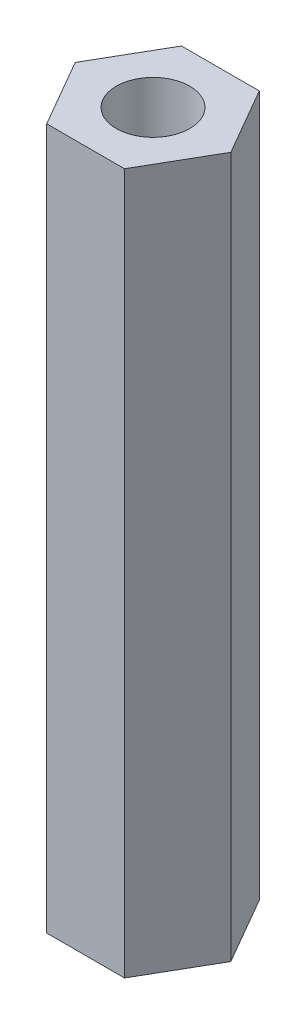
ISO-10303-21;
HEADER;
FILE_DESCRIPTION(('STEP AP214'),'2;1');
FILE_NAME('part.step','',(''),(''),'','','');
FILE_SCHEMA(('AUTOMOTIVE_DESIGN { 1 0 10303 214 1 1 1 1 }'));
ENDSEC;
DATA;
#1=APPLICATION_CONTEXT('core data for automotive mechanical design processes');
#2=APPLICATION_PROTOCOL_DEFINITION('international standard','automotive_design',2000,#1);
#3=PRODUCT_CONTEXT('',#1,'mechanical');
#4=PRODUCT('Part','Part','',(#3));
#5=PRODUCT_RELATED_PRODUCT_CATEGORY('part','',(#4));
#6=PRODUCT_DEFINITION_FORMATION('','',#4);
#7=PRODUCT_DEFINITION_CONTEXT('part definition',#1,'design');
#8=PRODUCT_DEFINITION('design','',#6,#7);
#9=PRODUCT_DEFINITION_SHAPE('','',#8);
#10=(LENGTH_UNIT() NAMED_UNIT(*) SI_UNIT(.MILLI.,.METRE.));
#11=(NAMED_UNIT(*) PLANE_ANGLE_UNIT() SI_UNIT($,.RADIAN.));
#12=(NAMED_UNIT(*) SI_UNIT($,.STERADIAN.) SOLID_ANGLE_UNIT());
#13=UNCERTAINTY_MEASURE_WITH_UNIT(LENGTH_MEASURE(1.E-05),#10,'distance_accuracy_value','');
#14=(GEOMETRIC_REPRESENTATION_CONTEXT(3) GLOBAL_UNCERTAINTY_ASSIGNED_CONTEXT((#13)) GLOBAL_UNIT_ASSIGNED_CONTEXT((#10,
#11,#12)) REPRESENTATION_CONTEXT('',''));
#15=CARTESIAN_POINT('',(0.,0.,0.));
#16=DIRECTION('',(0.,0.,1.));
#17=DIRECTION('',(1.,0.,0.));
#18=AXIS2_PLACEMENT_3D('',#15,#16,#17);
#19=CARTESIAN_POINT('',(1.58771324027147,28.6,2.75));
#20=DIRECTION('',(-0.866025403784439,0.,-0.5));
#21=DIRECTION('',(-0.5,0.,0.866025403784439));
#22=AXIS2_PLACEMENT_3D('',#19,#20,#21);
#23=PLANE('',#22);
#24=DIRECTION('',(0.,1.,0.));
#25=VECTOR('',#24,1.);
#26=CARTESIAN_POINT('',(3.17542648054294,28.6,0.));
#27=LINE('',#26,#25);
#28=CARTESIAN_POINT('',(3.17542648054294,0.,0.));
#29=VERTEX_POINT('',#28);
#30=CARTESIAN_POINT('',(3.17542648054294,28.6,0.));
#31=VERTEX_POINT('',#30);
#32=EDGE_CURVE('E66',#29,#31,#27,.T.);
#33=ORIENTED_EDGE('',*,*,#32,.T.);
#34=DIRECTION('',(0.5,0.,-0.866025403784439));
#35=VECTOR('',#34,1.);
#36=CARTESIAN_POINT('',(1.58771324027147,28.6,2.75));
#37=LINE('',#36,#35);
#38=CARTESIAN_POINT('',(1.58771324027147,28.6,2.75));
#39=VERTEX_POINT('',#38);
#40=EDGE_CURVE('E106',#39,#31,#37,.T.);
#41=ORIENTED_EDGE('',*,*,#40,.F.);
#42=DIRECTION('',(0.,1.,0.));
#43=VECTOR('',#42,1.);
#44=CARTESIAN_POINT('',(1.58771324027147,28.6,2.75));
#45=LINE('',#44,#43);
#46=CARTESIAN_POINT('',(1.58771324027147,0.,2.75));
#47=VERTEX_POINT('',#46);
#48=EDGE_CURVE('E93',#39,#47,#45,.F.);
#49=ORIENTED_EDGE('',*,*,#48,.T.);
#50=DIRECTION('',(0.5,0.,-0.866025403784439));
#51=VECTOR('',#50,1.);
#52=CARTESIAN_POINT('',(1.58771324027147,0.,2.75));
#53=LINE('',#52,#51);
#54=EDGE_CURVE('E107',#47,#29,#53,.T.);
#55=ORIENTED_EDGE('',*,*,#54,.T.);
#56=EDGE_LOOP('',(#33,#41,#49,#55));
#57=FACE_BOUND('',#56,.T.);
#58=ADVANCED_FACE('F17',(#57),#23,.F.);
#59=CARTESIAN_POINT('',(3.17542648054294,28.6,0.));
#60=DIRECTION('',(-0.866025403784439,0.,0.5));
#61=DIRECTION('',(0.5,0.,0.866025403784439));
#62=AXIS2_PLACEMENT_3D('',#59,#60,#61);
#63=PLANE('',#62);
#64=DIRECTION('',(0.,1.,0.));
#65=VECTOR('',#64,1.);
#66=CARTESIAN_POINT('',(1.58771324027147,28.6,-2.75));
#67=LINE('',#66,#65);
#68=CARTESIAN_POINT('',(1.58771324027147,0.,-2.75000000000001));
#69=VERTEX_POINT('',#68);
#70=CARTESIAN_POINT('',(1.58771324027147,28.6,-2.75));
#71=VERTEX_POINT('',#70);
#72=EDGE_CURVE('E73',#69,#71,#67,.T.);
#73=ORIENTED_EDGE('',*,*,#72,.T.);
#74=DIRECTION('',(-0.5,0.,-0.866025403784438));
#75=VECTOR('',#74,1.);
#76=CARTESIAN_POINT('',(3.17542648054294,28.6,0.));
#77=LINE('',#76,#75);
#78=EDGE_CURVE('E108',#31,#71,#77,.T.);
#79=ORIENTED_EDGE('',*,*,#78,.F.);
#80=ORIENTED_EDGE('',*,*,#32,.F.);
#81=DIRECTION('',(-0.5,0.,-0.866025403784438));
#82=VECTOR('',#81,1.);
#83=CARTESIAN_POINT('',(3.17542648054294,0.,0.));
#84=LINE('',#83,#82);
#85=EDGE_CURVE('E86',#29,#69,#84,.T.);
#86=ORIENTED_EDGE('',*,*,#85,.T.);
#87=EDGE_LOOP('',(#73,#79,#80,#86));
#88=FACE_BOUND('',#87,.T.);
#89=ADVANCED_FACE('F92',(#88),#63,.F.);
#90=CARTESIAN_POINT('',(1.58771324027147,28.6,-2.75));
#91=DIRECTION('',(0.,0.,1.));
#92=DIRECTION('',(1.,0.,0.));
#93=AXIS2_PLACEMENT_3D('',#90,#91,#92);
#94=PLANE('',#93);
#95=DIRECTION('',(0.,1.,0.));
#96=VECTOR('',#95,1.);
#97=CARTESIAN_POINT('',(-1.58771324027147,28.6,-2.75));
#98=LINE('',#97,#96);
#99=CARTESIAN_POINT('',(-1.58771324027147,0.,-2.75));
#100=VERTEX_POINT('',#99);
#101=CARTESIAN_POINT('',(-1.58771324027147,28.6,-2.75));
#102=VERTEX_POINT('',#101);
#103=EDGE_CURVE('E79',#100,#102,#98,.T.);
#104=ORIENTED_EDGE('',*,*,#103,.T.);
#105=DIRECTION('',(1.,0.,0.));
#106=VECTOR('',#105,1.);
#107=CARTESIAN_POINT('',(0.,28.6,-2.75));
#108=LINE('',#107,#106);
#109=EDGE_CURVE('E78',#71,#102,#108,.F.);
#110=ORIENTED_EDGE('',*,*,#109,.F.);
#111=ORIENTED_EDGE('',*,*,#72,.F.);
#112=DIRECTION('',(1.,0.,0.));
#113=VECTOR('',#112,1.);
#114=CARTESIAN_POINT('',(0.,0.,-2.75));
#115=LINE('',#114,#113);
#116=EDGE_CURVE('E77',#69,#100,#115,.F.);
#117=ORIENTED_EDGE('',*,*,#116,.T.);
#118=EDGE_LOOP('',(#104,#110,#111,#117));
#119=FACE_BOUND('',#118,.T.);
#120=ADVANCED_FACE('F76',(#119),#94,.F.);
#121=CARTESIAN_POINT('',(-1.58771324027147,28.6,-2.75));
#122=DIRECTION('',(0.866025403784439,0.,0.5));
#123=DIRECTION('',(0.5,0.,-0.866025403784439));
#124=AXIS2_PLACEMENT_3D('',#121,#122,#123);
#125=PLANE('',#124);
#126=DIRECTION('',(0.,1.,0.));
#127=VECTOR('',#126,1.);
#128=CARTESIAN_POINT('',(-3.17542648054294,28.6,0.));
#129=LINE('',#128,#127);
#130=CARTESIAN_POINT('',(-3.17542648054295,0.,0.));
#131=VERTEX_POINT('',#130);
#132=CARTESIAN_POINT('',(-3.17542648054294,28.6,0.));
#133=VERTEX_POINT('',#132);
#134=EDGE_CURVE('E100',#131,#133,#129,.T.);
#135=ORIENTED_EDGE('',*,*,#134,.T.);
#136=DIRECTION('',(-0.5,0.,0.866025403784438));
#137=VECTOR('',#136,1.);
#138=CARTESIAN_POINT('',(-1.58771324027147,28.6,-2.75));
#139=LINE('',#138,#137);
#140=EDGE_CURVE('E110',#102,#133,#139,.T.);
#141=ORIENTED_EDGE('',*,*,#140,.F.);
#142=ORIENTED_EDGE('',*,*,#103,.F.);
#143=DIRECTION('',(-0.5,0.,0.866025403784438));
#144=VECTOR('',#143,1.);
#145=CARTESIAN_POINT('',(-1.58771324027147,0.,-2.75));
#146=LINE('',#145,#144);
#147=EDGE_CURVE('E90',#100,#131,#146,.T.);
#148=ORIENTED_EDGE('',*,*,#147,.T.);
#149=EDGE_LOOP('',(#135,#141,#142,#148));
#150=FACE_BOUND('',#149,.T.);
#151=ADVANCED_FACE('F122',(#150),#125,.F.);
#152=CARTESIAN_POINT('',(-3.17542648054294,28.6,0.));
#153=DIRECTION('',(0.866025403784439,0.,-0.5));
#154=DIRECTION('',(-0.5,0.,-0.866025403784439));
#155=AXIS2_PLACEMENT_3D('',#152,#153,#154);
#156=PLANE('',#155);
#157=DIRECTION('',(0.,1.,0.));
#158=VECTOR('',#157,1.);
#159=CARTESIAN_POINT('',(-1.58771324027147,28.6,2.75));
#160=LINE('',#159,#158);
#161=CARTESIAN_POINT('',(-1.58771324027147,0.,2.75));
#162=VERTEX_POINT('',#161);
#163=CARTESIAN_POINT('',(-1.58771324027147,28.6,2.75));
#164=VERTEX_POINT('',#163);
#165=EDGE_CURVE('E95',#162,#164,#160,.T.);
#166=ORIENTED_EDGE('',*,*,#165,.T.);
#167=DIRECTION('',(0.5,0.,0.866025403784439));
#168=VECTOR('',#167,1.);
#169=CARTESIAN_POINT('',(-3.17542648054294,28.6,0.));
#170=LINE('',#169,#168);
#171=EDGE_CURVE('E33',#133,#164,#170,.T.);
#172=ORIENTED_EDGE('',*,*,#171,.F.);
#173=ORIENTED_EDGE('',*,*,#134,.F.);
#174=DIRECTION('',(0.5,0.,0.866025403784439));
#175=VECTOR('',#174,1.);
#176=CARTESIAN_POINT('',(-3.17542648054294,0.,0.));
#177=LINE('',#176,#175);
#178=EDGE_CURVE('E119',#131,#162,#177,.T.);
#179=ORIENTED_EDGE('',*,*,#178,.T.);
#180=EDGE_LOOP('',(#166,#172,#173,#179));
#181=FACE_BOUND('',#180,.T.);
#182=ADVANCED_FACE('F150',(#181),#156,.F.);
#183=CARTESIAN_POINT('',(-1.58771324027147,28.6,2.75));
#184=DIRECTION('',(0.,0.,-1.));
#185=DIRECTION('',(-1.,0.,0.));
#186=AXIS2_PLACEMENT_3D('',#183,#184,#185);
#187=PLANE('',#186);
#188=ORIENTED_EDGE('',*,*,#48,.F.);
#189=DIRECTION('',(1.,0.,0.));
#190=VECTOR('',#189,1.);
#191=CARTESIAN_POINT('',(0.,28.6,2.75));
#192=LINE('',#191,#190);
#193=EDGE_CURVE('E124',#164,#39,#192,.T.);
#194=ORIENTED_EDGE('',*,*,#193,.F.);
#195=ORIENTED_EDGE('',*,*,#165,.F.);
#196=DIRECTION('',(1.,0.,0.));
#197=VECTOR('',#196,1.);
#198=CARTESIAN_POINT('',(0.,0.,2.75));
#199=LINE('',#198,#197);
#200=EDGE_CURVE('E116',#162,#47,#199,.T.);
#201=ORIENTED_EDGE('',*,*,#200,.T.);
#202=EDGE_LOOP('',(#188,#194,#195,#201));
#203=FACE_BOUND('',#202,.T.);
#204=ADVANCED_FACE('F145',(#203),#187,.F.);
#205=CARTESIAN_POINT('',(0.,0.,0.));
#206=DIRECTION('',(0.,1.,0.));
#207=DIRECTION('',(0.,0.,1.));
#208=AXIS2_PLACEMENT_3D('',#205,#206,#207);
#209=PLANE('',#208);
#210=CARTESIAN_POINT('',(0.,0.,0.));
#211=DIRECTION('',(0.,-1.,0.));
#212=DIRECTION('',(0.,0.,-1.));
#213=AXIS2_PLACEMENT_3D('',#210,#211,#212);
#214=CIRCLE('',#213,1.5);
#215=CARTESIAN_POINT('',(0.,0.,-1.5));
#216=VERTEX_POINT('',#215);
#217=EDGE_CURVE('E20',#216,#216,#214,.F.);
#218=ORIENTED_EDGE('',*,*,#217,.T.);
#219=EDGE_LOOP('',(#218));
#220=FACE_BOUND('',#219,.T.);
#221=ORIENTED_EDGE('',*,*,#200,.F.);
#222=ORIENTED_EDGE('',*,*,#178,.F.);
#223=ORIENTED_EDGE('',*,*,#147,.F.);
#224=ORIENTED_EDGE('',*,*,#116,.F.);
#225=ORIENTED_EDGE('',*,*,#85,.F.);
#226=ORIENTED_EDGE('',*,*,#54,.F.);
#227=EDGE_LOOP('',(#221,#222,#223,#224,#225,#226));
#228=FACE_BOUND('',#227,.T.);
#229=ADVANCED_FACE('F84',(#220,#228),#209,.F.);
#230=CARTESIAN_POINT('',(0.,28.6,0.));
#231=DIRECTION('',(0.,1.,0.));
#232=DIRECTION('',(0.,0.,1.));
#233=AXIS2_PLACEMENT_3D('',#230,#231,#232);
#234=PLANE('',#233);
#235=CARTESIAN_POINT('',(0.,28.6,0.));
#236=DIRECTION('',(0.,-1.,0.));
#237=DIRECTION('',(0.,0.,-1.));
#238=AXIS2_PLACEMENT_3D('',#235,#236,#237);
#239=CIRCLE('',#238,1.5);
#240=CARTESIAN_POINT('',(0.,28.6,-1.5));
#241=VERTEX_POINT('',#240);
#242=EDGE_CURVE('E11',#241,#241,#239,.T.);
#243=ORIENTED_EDGE('',*,*,#242,.T.);
#244=EDGE_LOOP('',(#243));
#245=FACE_BOUND('',#244,.T.);
#246=ORIENTED_EDGE('',*,*,#171,.T.);
#247=ORIENTED_EDGE('',*,*,#193,.T.);
#248=ORIENTED_EDGE('',*,*,#40,.T.);
#249=ORIENTED_EDGE('',*,*,#78,.T.);
#250=ORIENTED_EDGE('',*,*,#109,.T.);
#251=ORIENTED_EDGE('',*,*,#140,.T.);
#252=EDGE_LOOP('',(#246,#247,#248,#249,#250,#251));
#253=FACE_BOUND('',#252,.T.);
#254=ADVANCED_FACE('F135',(#245,#253),#234,.T.);
#255=CARTESIAN_POINT('',(0.,28.6,0.));
#256=DIRECTION('',(0.,-1.,0.));
#257=DIRECTION('',(0.,0.,-1.));
#258=AXIS2_PLACEMENT_3D('',#255,#256,#257);
#259=CYLINDRICAL_SURFACE('',#258,1.5);
#260=ORIENTED_EDGE('',*,*,#217,.F.);
#261=EDGE_LOOP('',(#260));
#262=FACE_BOUND('',#261,.T.);
#263=ORIENTED_EDGE('',*,*,#242,.F.);
#264=EDGE_LOOP('',(#263));
#265=FACE_BOUND('',#264,.T.);
#266=ADVANCED_FACE('F132',(#262,#265),#259,.F.);
#267=CLOSED_SHELL('',(#58,#89,#120,#151,#182,#204,#229,#254,#266));
#268=MANIFOLD_SOLID_BREP('B1',#267);
#269=ADVANCED_BREP_SHAPE_REPRESENTATION('',(#18,#268),#14);
#270=SHAPE_DEFINITION_REPRESENTATION(#9,#269);
ENDSEC;
END-ISO-10303-21;
